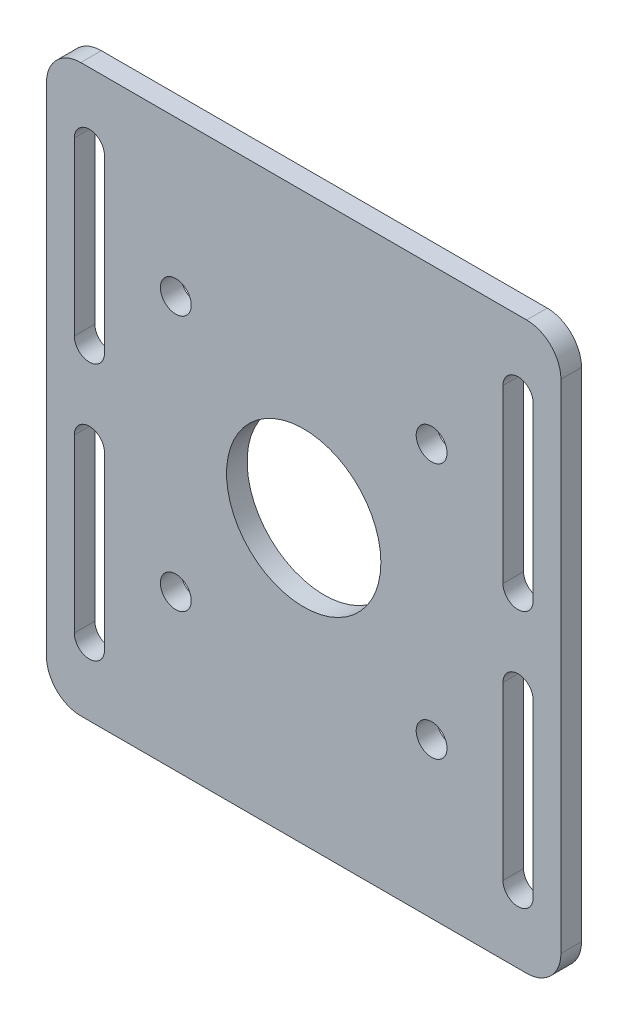
ISO-10303-21;
HEADER;
FILE_DESCRIPTION(('STEP AP214'),'2;1');
FILE_NAME('part.step','',(''),(''),'','','');
FILE_SCHEMA(('AUTOMOTIVE_DESIGN { 1 0 10303 214 1 1 1 1 }'));
ENDSEC;
DATA;
#1=APPLICATION_CONTEXT('core data for automotive mechanical design processes');
#2=APPLICATION_PROTOCOL_DEFINITION('international standard','automotive_design',2000,#1);
#3=PRODUCT_CONTEXT('',#1,'mechanical');
#4=PRODUCT('Part','Part','',(#3));
#5=PRODUCT_RELATED_PRODUCT_CATEGORY('part','',(#4));
#6=PRODUCT_DEFINITION_FORMATION('','',#4);
#7=PRODUCT_DEFINITION_CONTEXT('part definition',#1,'design');
#8=PRODUCT_DEFINITION('design','',#6,#7);
#9=PRODUCT_DEFINITION_SHAPE('','',#8);
#10=(LENGTH_UNIT() NAMED_UNIT(*) SI_UNIT(.MILLI.,.METRE.));
#11=(NAMED_UNIT(*) PLANE_ANGLE_UNIT() SI_UNIT($,.RADIAN.));
#12=(NAMED_UNIT(*) SI_UNIT($,.STERADIAN.) SOLID_ANGLE_UNIT());
#13=UNCERTAINTY_MEASURE_WITH_UNIT(LENGTH_MEASURE(1.E-05),#10,'distance_accuracy_value','');
#14=(GEOMETRIC_REPRESENTATION_CONTEXT(3) GLOBAL_UNCERTAINTY_ASSIGNED_CONTEXT((#13)) GLOBAL_UNIT_ASSIGNED_CONTEXT((#10,
#11,#12)) REPRESENTATION_CONTEXT('',''));
#15=CARTESIAN_POINT('',(0.,0.,0.));
#16=DIRECTION('',(0.,0.,1.));
#17=DIRECTION('',(1.,0.,0.));
#18=AXIS2_PLACEMENT_3D('',#15,#16,#17);
#19=CARTESIAN_POINT('',(0.,0.,6.));
#20=DIRECTION('',(0.,0.,-1.));
#21=DIRECTION('',(-1.,0.,0.));
#22=AXIS2_PLACEMENT_3D('',#19,#20,#21);
#23=PLANE('',#22);
#24=CARTESIAN_POINT('',(-74.5997654151811,-74.5997654151804,6.));
#25=DIRECTION('',(0.,0.,1.));
#26=DIRECTION('',(1.,0.,0.));
#27=AXIS2_PLACEMENT_3D('',#24,#25,#26);
#28=CIRCLE('',#27,8.99999999999999);
#29=CARTESIAN_POINT('',(-65.5997654151811,-74.5997654151804,6.));
#30=VERTEX_POINT('',#29);
#31=EDGE_CURVE('E788',#30,#30,#28,.T.);
#32=ORIENTED_EDGE('',*,*,#31,.F.);
#33=EDGE_LOOP('',(#32));
#34=FACE_BOUND('',#33,.T.);
#35=CARTESIAN_POINT('',(74.5997654151804,-74.5997654151811,6.));
#36=DIRECTION('',(0.,0.,1.));
#37=DIRECTION('',(1.,0.,0.));
#38=AXIS2_PLACEMENT_3D('',#35,#36,#37);
#39=CIRCLE('',#38,8.99999999999999);
#40=CARTESIAN_POINT('',(83.5997654151804,-74.5997654151811,6.));
#41=VERTEX_POINT('',#40);
#42=EDGE_CURVE('E793',#41,#41,#39,.T.);
#43=ORIENTED_EDGE('',*,*,#42,.F.);
#44=EDGE_LOOP('',(#43));
#45=FACE_BOUND('',#44,.T.);
#46=CARTESIAN_POINT('',(74.5997654151812,74.5997654151804,6.));
#47=DIRECTION('',(0.,0.,1.));
#48=DIRECTION('',(1.,0.,0.));
#49=AXIS2_PLACEMENT_3D('',#46,#47,#48);
#50=CIRCLE('',#49,8.99999999999999);
#51=CARTESIAN_POINT('',(83.5997654151811,74.5997654151804,6.));
#52=VERTEX_POINT('',#51);
#53=EDGE_CURVE('E813',#52,#52,#50,.T.);
#54=ORIENTED_EDGE('',*,*,#53,.F.);
#55=EDGE_LOOP('',(#54));
#56=FACE_BOUND('',#55,.T.);
#57=CARTESIAN_POINT('',(-74.5997654151804,74.5997654151812,6.));
#58=DIRECTION('',(0.,0.,1.));
#59=DIRECTION('',(1.,0.,0.));
#60=AXIS2_PLACEMENT_3D('',#57,#58,#59);
#61=CIRCLE('',#60,8.99999999999999);
#62=CARTESIAN_POINT('',(-65.5997654151804,74.5997654151812,6.));
#63=VERTEX_POINT('',#62);
#64=EDGE_CURVE('E803',#63,#63,#61,.T.);
#65=ORIENTED_EDGE('',*,*,#64,.F.);
#66=EDGE_LOOP('',(#65));
#67=FACE_BOUND('',#66,.T.);
#68=DIRECTION('',(0.,-1.,0.));
#69=VECTOR('',#68,1.);
#70=CARTESIAN_POINT('',(116.2,125.,6.));
#71=LINE('',#70,#69);
#72=CARTESIAN_POINT('',(116.2,125.,6.));
#73=VERTEX_POINT('',#72);
#74=CARTESIAN_POINT('',(116.2,25.,6.));
#75=VERTEX_POINT('',#74);
#76=EDGE_CURVE('E335',#73,#75,#71,.T.);
#77=ORIENTED_EDGE('',*,*,#76,.F.);
#78=CARTESIAN_POINT('',(125.,125.,6.));
#79=DIRECTION('',(0.,0.,1.));
#80=DIRECTION('',(-1.,0.,0.));
#81=AXIS2_PLACEMENT_3D('',#78,#79,#80);
#82=CIRCLE('',#81,8.79999999999998);
#83=CARTESIAN_POINT('',(133.8,125.,6.));
#84=VERTEX_POINT('',#83);
#85=EDGE_CURVE('E332',#84,#73,#82,.T.);
#86=ORIENTED_EDGE('',*,*,#85,.F.);
#87=DIRECTION('',(0.,1.,0.));
#88=VECTOR('',#87,1.);
#89=CARTESIAN_POINT('',(133.8,125.,6.));
#90=LINE('',#89,#88);
#91=CARTESIAN_POINT('',(133.8,25.,6.));
#92=VERTEX_POINT('',#91);
#93=EDGE_CURVE('E319',#92,#84,#90,.T.);
#94=ORIENTED_EDGE('',*,*,#93,.F.);
#95=CARTESIAN_POINT('',(125.,25.,6.));
#96=DIRECTION('',(0.,0.,1.));
#97=DIRECTION('',(-1.,0.,0.));
#98=AXIS2_PLACEMENT_3D('',#95,#96,#97);
#99=CIRCLE('',#98,8.79999999999997);
#100=EDGE_CURVE('E339',#75,#92,#99,.T.);
#101=ORIENTED_EDGE('',*,*,#100,.F.);
#102=EDGE_LOOP('',(#77,#86,#94,#101));
#103=FACE_BOUND('',#102,.T.);
#104=DIRECTION('',(0.,1.,0.));
#105=VECTOR('',#104,1.);
#106=CARTESIAN_POINT('',(133.8,-125.,6.));
#107=LINE('',#106,#105);
#108=CARTESIAN_POINT('',(133.8,-125.,6.));
#109=VERTEX_POINT('',#108);
#110=CARTESIAN_POINT('',(133.8,-25.,6.));
#111=VERTEX_POINT('',#110);
#112=EDGE_CURVE('E291',#109,#111,#107,.T.);
#113=ORIENTED_EDGE('',*,*,#112,.F.);
#114=CARTESIAN_POINT('',(125.,-125.,6.));
#115=DIRECTION('',(0.,0.,1.));
#116=DIRECTION('',(1.,0.,0.));
#117=AXIS2_PLACEMENT_3D('',#114,#115,#116);
#118=CIRCLE('',#117,8.79999999999998);
#119=CARTESIAN_POINT('',(116.2,-125.,6.));
#120=VERTEX_POINT('',#119);
#121=EDGE_CURVE('E288',#120,#109,#118,.T.);
#122=ORIENTED_EDGE('',*,*,#121,.F.);
#123=DIRECTION('',(0.,-1.,0.));
#124=VECTOR('',#123,1.);
#125=CARTESIAN_POINT('',(116.2,-125.,6.));
#126=LINE('',#125,#124);
#127=CARTESIAN_POINT('',(116.2,-25.,6.));
#128=VERTEX_POINT('',#127);
#129=EDGE_CURVE('E275',#128,#120,#126,.T.);
#130=ORIENTED_EDGE('',*,*,#129,.F.);
#131=CARTESIAN_POINT('',(125.,-25.,6.));
#132=DIRECTION('',(0.,0.,1.));
#133=DIRECTION('',(1.,0.,0.));
#134=AXIS2_PLACEMENT_3D('',#131,#132,#133);
#135=CIRCLE('',#134,8.79999999999997);
#136=EDGE_CURVE('E296',#111,#128,#135,.T.);
#137=ORIENTED_EDGE('',*,*,#136,.F.);
#138=EDGE_LOOP('',(#113,#122,#130,#137));
#139=FACE_BOUND('',#138,.T.);
#140=DIRECTION('',(0.,1.,0.));
#141=VECTOR('',#140,1.);
#142=CARTESIAN_POINT('',(-116.2,-125.,6.));
#143=LINE('',#142,#141);
#144=CARTESIAN_POINT('',(-116.2,-125.,6.));
#145=VERTEX_POINT('',#144);
#146=CARTESIAN_POINT('',(-116.2,-25.,6.));
#147=VERTEX_POINT('',#146);
#148=EDGE_CURVE('E254',#145,#147,#143,.T.);
#149=ORIENTED_EDGE('',*,*,#148,.F.);
#150=CARTESIAN_POINT('',(-125.,-125.,6.));
#151=DIRECTION('',(0.,0.,1.));
#152=DIRECTION('',(-1.,0.,0.));
#153=AXIS2_PLACEMENT_3D('',#150,#151,#152);
#154=CIRCLE('',#153,8.79999999999997);
#155=CARTESIAN_POINT('',(-133.8,-125.,6.));
#156=VERTEX_POINT('',#155);
#157=EDGE_CURVE('E216',#156,#145,#154,.T.);
#158=ORIENTED_EDGE('',*,*,#157,.F.);
#159=DIRECTION('',(0.,-1.,0.));
#160=VECTOR('',#159,1.);
#161=CARTESIAN_POINT('',(-133.8,-125.,6.));
#162=LINE('',#161,#160);
#163=CARTESIAN_POINT('',(-133.8,-24.9999999999999,6.));
#164=VERTEX_POINT('',#163);
#165=EDGE_CURVE('E237',#164,#156,#162,.T.);
#166=ORIENTED_EDGE('',*,*,#165,.F.);
#167=CARTESIAN_POINT('',(-125.,-25.,6.));
#168=DIRECTION('',(0.,0.,1.));
#169=DIRECTION('',(-1.,0.,0.));
#170=AXIS2_PLACEMENT_3D('',#167,#168,#169);
#171=CIRCLE('',#170,8.79999999999997);
#172=EDGE_CURVE('E242',#147,#164,#171,.T.);
#173=ORIENTED_EDGE('',*,*,#172,.F.);
#174=EDGE_LOOP('',(#149,#158,#166,#173));
#175=FACE_BOUND('',#174,.T.);
#176=DIRECTION('',(0.,-1.,0.));
#177=VECTOR('',#176,1.);
#178=CARTESIAN_POINT('',(-133.8,125.,6.));
#179=LINE('',#178,#177);
#180=CARTESIAN_POINT('',(-133.8,125.,6.));
#181=VERTEX_POINT('',#180);
#182=CARTESIAN_POINT('',(-133.8,24.9999999999999,6.));
#183=VERTEX_POINT('',#182);
#184=EDGE_CURVE('E377',#181,#183,#179,.T.);
#185=ORIENTED_EDGE('',*,*,#184,.F.);
#186=CARTESIAN_POINT('',(-125.,125.,6.));
#187=DIRECTION('',(0.,0.,1.));
#188=DIRECTION('',(1.,0.,0.));
#189=AXIS2_PLACEMENT_3D('',#186,#187,#188);
#190=CIRCLE('',#189,8.79999999999997);
#191=CARTESIAN_POINT('',(-116.2,125.,6.));
#192=VERTEX_POINT('',#191);
#193=EDGE_CURVE('E264',#192,#181,#190,.T.);
#194=ORIENTED_EDGE('',*,*,#193,.F.);
#195=DIRECTION('',(0.,1.,0.));
#196=VECTOR('',#195,1.);
#197=CARTESIAN_POINT('',(-116.2,125.,6.));
#198=LINE('',#197,#196);
#199=CARTESIAN_POINT('',(-116.2,25.,6.));
#200=VERTEX_POINT('',#199);
#201=EDGE_CURVE('E362',#200,#192,#198,.T.);
#202=ORIENTED_EDGE('',*,*,#201,.F.);
#203=CARTESIAN_POINT('',(-125.,25.,6.));
#204=DIRECTION('',(0.,0.,1.));
#205=DIRECTION('',(1.,0.,0.));
#206=AXIS2_PLACEMENT_3D('',#203,#204,#205);
#207=CIRCLE('',#206,8.79999999999997);
#208=EDGE_CURVE('E381',#183,#200,#207,.T.);
#209=ORIENTED_EDGE('',*,*,#208,.F.);
#210=EDGE_LOOP('',(#185,#194,#202,#209));
#211=FACE_BOUND('',#210,.T.);
#212=DIRECTION('',(1.,0.,0.));
#213=VECTOR('',#212,1.);
#214=CARTESIAN_POINT('',(-150.,-165.,6.));
#215=LINE('',#214,#213);
#216=CARTESIAN_POINT('',(-130.,-165.,6.));
#217=VERTEX_POINT('',#216);
#218=CARTESIAN_POINT('',(130.,-165.,6.));
#219=VERTEX_POINT('',#218);
#220=EDGE_CURVE('E420',#217,#219,#215,.T.);
#221=ORIENTED_EDGE('',*,*,#220,.T.);
#222=CARTESIAN_POINT('',(130.,-145.,6.));
#223=DIRECTION('',(0.,0.,-1.));
#224=DIRECTION('',(-1.,0.,0.));
#225=AXIS2_PLACEMENT_3D('',#222,#223,#224);
#226=CIRCLE('',#225,20.);
#227=CARTESIAN_POINT('',(150.,-145.,6.));
#228=VERTEX_POINT('',#227);
#229=EDGE_CURVE('E471',#219,#228,#226,.F.);
#230=ORIENTED_EDGE('',*,*,#229,.T.);
#231=DIRECTION('',(0.,1.,0.));
#232=VECTOR('',#231,1.);
#233=CARTESIAN_POINT('',(150.,-165.,6.));
#234=LINE('',#233,#232);
#235=CARTESIAN_POINT('',(150.,145.,6.));
#236=VERTEX_POINT('',#235);
#237=EDGE_CURVE('E409',#228,#236,#234,.T.);
#238=ORIENTED_EDGE('',*,*,#237,.T.);
#239=CARTESIAN_POINT('',(130.,145.,6.));
#240=DIRECTION('',(0.,0.,-1.));
#241=DIRECTION('',(-1.,0.,0.));
#242=AXIS2_PLACEMENT_3D('',#239,#240,#241);
#243=CIRCLE('',#242,20.);
#244=CARTESIAN_POINT('',(130.,165.,6.));
#245=VERTEX_POINT('',#244);
#246=EDGE_CURVE('E465',#236,#245,#243,.F.);
#247=ORIENTED_EDGE('',*,*,#246,.T.);
#248=DIRECTION('',(-1.,0.,0.));
#249=VECTOR('',#248,1.);
#250=CARTESIAN_POINT('',(-150.,165.,6.));
#251=LINE('',#250,#249);
#252=CARTESIAN_POINT('',(-130.,165.,6.));
#253=VERTEX_POINT('',#252);
#254=EDGE_CURVE('E413',#245,#253,#251,.T.);
#255=ORIENTED_EDGE('',*,*,#254,.T.);
#256=CARTESIAN_POINT('',(-130.,145.,6.));
#257=DIRECTION('',(0.,0.,-1.));
#258=DIRECTION('',(-1.,0.,0.));
#259=AXIS2_PLACEMENT_3D('',#256,#257,#258);
#260=CIRCLE('',#259,20.);
#261=CARTESIAN_POINT('',(-150.,145.,6.));
#262=VERTEX_POINT('',#261);
#263=EDGE_CURVE('E68',#253,#262,#260,.F.);
#264=ORIENTED_EDGE('',*,*,#263,.T.);
#265=DIRECTION('',(0.,-1.,0.));
#266=VECTOR('',#265,1.);
#267=CARTESIAN_POINT('',(-150.,-165.,6.));
#268=LINE('',#267,#266);
#269=CARTESIAN_POINT('',(-150.,-145.,6.));
#270=VERTEX_POINT('',#269);
#271=EDGE_CURVE('E417',#262,#270,#268,.T.);
#272=ORIENTED_EDGE('',*,*,#271,.T.);
#273=CARTESIAN_POINT('',(-130.,-145.,6.));
#274=DIRECTION('',(0.,0.,-1.));
#275=DIRECTION('',(-1.,0.,0.));
#276=AXIS2_PLACEMENT_3D('',#273,#274,#275);
#277=CIRCLE('',#276,20.);
#278=EDGE_CURVE('E468',#270,#217,#277,.F.);
#279=ORIENTED_EDGE('',*,*,#278,.T.);
#280=EDGE_LOOP('',(#221,#230,#238,#247,#255,#264,#272,#279));
#281=FACE_BOUND('',#280,.T.);
#282=CARTESIAN_POINT('',(0.,0.,6.));
#283=DIRECTION('',(0.,0.,1.));
#284=DIRECTION('',(1.,0.,0.));
#285=AXIS2_PLACEMENT_3D('',#282,#283,#284);
#286=CIRCLE('',#285,45.);
#287=CARTESIAN_POINT('',(45.,0.,6.));
#288=VERTEX_POINT('',#287);
#289=EDGE_CURVE('E401',#288,#288,#286,.T.);
#290=ORIENTED_EDGE('',*,*,#289,.F.);
#291=EDGE_LOOP('',(#290));
#292=FACE_BOUND('',#291,.T.);
#293=ADVANCED_FACE('F45',(#34,#45,#56,#67,#103,#139,#175,#211,#281,#292),#23,.F.);
#294=CARTESIAN_POINT('',(0.,0.,-6.));
#295=DIRECTION('',(0.,0.,-1.));
#296=DIRECTION('',(-1.,0.,0.));
#297=AXIS2_PLACEMENT_3D('',#294,#295,#296);
#298=PLANE('',#297);
#299=CARTESIAN_POINT('',(-74.5997654151811,-74.5997654151804,-6.));
#300=DIRECTION('',(0.,0.,-1.));
#301=DIRECTION('',(-1.,0.,0.));
#302=AXIS2_PLACEMENT_3D('',#299,#300,#301);
#303=CIRCLE('',#302,8.99999999999999);
#304=CARTESIAN_POINT('',(-83.5997654151811,-74.5997654151804,-6.));
#305=VERTEX_POINT('',#304);
#306=EDGE_CURVE('E791',#305,#305,#303,.F.);
#307=ORIENTED_EDGE('',*,*,#306,.T.);
#308=EDGE_LOOP('',(#307));
#309=FACE_BOUND('',#308,.T.);
#310=CARTESIAN_POINT('',(74.5997654151804,-74.5997654151811,-6.));
#311=DIRECTION('',(0.,0.,-1.));
#312=DIRECTION('',(-1.,0.,0.));
#313=AXIS2_PLACEMENT_3D('',#310,#311,#312);
#314=CIRCLE('',#313,8.99999999999999);
#315=CARTESIAN_POINT('',(65.5997654151804,-74.5997654151811,-6.));
#316=VERTEX_POINT('',#315);
#317=EDGE_CURVE('E799',#316,#316,#314,.F.);
#318=ORIENTED_EDGE('',*,*,#317,.T.);
#319=EDGE_LOOP('',(#318));
#320=FACE_BOUND('',#319,.T.);
#321=CARTESIAN_POINT('',(74.5997654151812,74.5997654151804,-6.));
#322=DIRECTION('',(0.,0.,-1.));
#323=DIRECTION('',(-1.,0.,0.));
#324=AXIS2_PLACEMENT_3D('',#321,#322,#323);
#325=CIRCLE('',#324,8.99999999999999);
#326=CARTESIAN_POINT('',(65.5997654151812,74.5997654151804,-6.));
#327=VERTEX_POINT('',#326);
#328=EDGE_CURVE('E806',#327,#327,#325,.F.);
#329=ORIENTED_EDGE('',*,*,#328,.T.);
#330=EDGE_LOOP('',(#329));
#331=FACE_BOUND('',#330,.T.);
#332=CARTESIAN_POINT('',(-74.5997654151804,74.5997654151812,-6.));
#333=DIRECTION('',(0.,0.,-1.));
#334=DIRECTION('',(-1.,0.,0.));
#335=AXIS2_PLACEMENT_3D('',#332,#333,#334);
#336=CIRCLE('',#335,8.99999999999999);
#337=CARTESIAN_POINT('',(-83.5997654151804,74.5997654151812,-6.));
#338=VERTEX_POINT('',#337);
#339=EDGE_CURVE('E245',#338,#338,#336,.F.);
#340=ORIENTED_EDGE('',*,*,#339,.T.);
#341=EDGE_LOOP('',(#340));
#342=FACE_BOUND('',#341,.T.);
#343=CARTESIAN_POINT('',(125.,125.,-6.));
#344=DIRECTION('',(0.,0.,1.));
#345=DIRECTION('',(-1.,0.,0.));
#346=AXIS2_PLACEMENT_3D('',#343,#344,#345);
#347=CIRCLE('',#346,8.79999999999998);
#348=CARTESIAN_POINT('',(133.8,125.,-6.));
#349=VERTEX_POINT('',#348);
#350=CARTESIAN_POINT('',(116.2,125.,-6.));
#351=VERTEX_POINT('',#350);
#352=EDGE_CURVE('E314',#349,#351,#347,.T.);
#353=ORIENTED_EDGE('',*,*,#352,.T.);
#354=DIRECTION('',(0.,-1.,0.));
#355=VECTOR('',#354,1.);
#356=CARTESIAN_POINT('',(116.2,125.,-6.));
#357=LINE('',#356,#355);
#358=CARTESIAN_POINT('',(116.2,25.,-6.));
#359=VERTEX_POINT('',#358);
#360=EDGE_CURVE('E318',#351,#359,#357,.T.);
#361=ORIENTED_EDGE('',*,*,#360,.T.);
#362=CARTESIAN_POINT('',(125.,25.,-6.));
#363=DIRECTION('',(0.,0.,1.));
#364=DIRECTION('',(-1.,0.,0.));
#365=AXIS2_PLACEMENT_3D('',#362,#363,#364);
#366=CIRCLE('',#365,8.79999999999997);
#367=CARTESIAN_POINT('',(133.8,25.,-6.));
#368=VERTEX_POINT('',#367);
#369=EDGE_CURVE('E323',#359,#368,#366,.T.);
#370=ORIENTED_EDGE('',*,*,#369,.T.);
#371=DIRECTION('',(0.,1.,0.));
#372=VECTOR('',#371,1.);
#373=CARTESIAN_POINT('',(133.8,125.,-6.));
#374=LINE('',#373,#372);
#375=EDGE_CURVE('E327',#368,#349,#374,.T.);
#376=ORIENTED_EDGE('',*,*,#375,.T.);
#377=EDGE_LOOP('',(#353,#361,#370,#376));
#378=FACE_BOUND('',#377,.T.);
#379=CARTESIAN_POINT('',(125.,-125.,-6.));
#380=DIRECTION('',(0.,0.,1.));
#381=DIRECTION('',(1.,0.,0.));
#382=AXIS2_PLACEMENT_3D('',#379,#380,#381);
#383=CIRCLE('',#382,8.79999999999998);
#384=CARTESIAN_POINT('',(116.2,-125.,-6.));
#385=VERTEX_POINT('',#384);
#386=CARTESIAN_POINT('',(133.8,-125.,-6.));
#387=VERTEX_POINT('',#386);
#388=EDGE_CURVE('E270',#385,#387,#383,.T.);
#389=ORIENTED_EDGE('',*,*,#388,.T.);
#390=DIRECTION('',(0.,1.,0.));
#391=VECTOR('',#390,1.);
#392=CARTESIAN_POINT('',(133.8,-125.,-6.));
#393=LINE('',#392,#391);
#394=CARTESIAN_POINT('',(133.8,-25.,-6.));
#395=VERTEX_POINT('',#394);
#396=EDGE_CURVE('E274',#387,#395,#393,.T.);
#397=ORIENTED_EDGE('',*,*,#396,.T.);
#398=CARTESIAN_POINT('',(125.,-25.,-6.));
#399=DIRECTION('',(0.,0.,1.));
#400=DIRECTION('',(1.,0.,0.));
#401=AXIS2_PLACEMENT_3D('',#398,#399,#400);
#402=CIRCLE('',#401,8.79999999999997);
#403=CARTESIAN_POINT('',(116.2,-25.,-6.));
#404=VERTEX_POINT('',#403);
#405=EDGE_CURVE('E279',#395,#404,#402,.T.);
#406=ORIENTED_EDGE('',*,*,#405,.T.);
#407=DIRECTION('',(0.,-1.,0.));
#408=VECTOR('',#407,1.);
#409=CARTESIAN_POINT('',(116.2,-125.,-6.));
#410=LINE('',#409,#408);
#411=EDGE_CURVE('E283',#404,#385,#410,.T.);
#412=ORIENTED_EDGE('',*,*,#411,.T.);
#413=EDGE_LOOP('',(#389,#397,#406,#412));
#414=FACE_BOUND('',#413,.T.);
#415=CARTESIAN_POINT('',(-125.,-125.,-6.));
#416=DIRECTION('',(0.,0.,1.));
#417=DIRECTION('',(-1.,0.,0.));
#418=AXIS2_PLACEMENT_3D('',#415,#416,#417);
#419=CIRCLE('',#418,8.79999999999997);
#420=CARTESIAN_POINT('',(-133.8,-125.,-6.));
#421=VERTEX_POINT('',#420);
#422=CARTESIAN_POINT('',(-116.2,-125.,-6.));
#423=VERTEX_POINT('',#422);
#424=EDGE_CURVE('E213',#421,#423,#419,.T.);
#425=ORIENTED_EDGE('',*,*,#424,.T.);
#426=DIRECTION('',(0.,1.,0.));
#427=VECTOR('',#426,1.);
#428=CARTESIAN_POINT('',(-116.2,-125.,-6.));
#429=LINE('',#428,#427);
#430=CARTESIAN_POINT('',(-116.2,-25.,-6.));
#431=VERTEX_POINT('',#430);
#432=EDGE_CURVE('E226',#423,#431,#429,.T.);
#433=ORIENTED_EDGE('',*,*,#432,.T.);
#434=CARTESIAN_POINT('',(-125.,-25.,-6.));
#435=DIRECTION('',(0.,0.,1.));
#436=DIRECTION('',(-1.,0.,0.));
#437=AXIS2_PLACEMENT_3D('',#434,#435,#436);
#438=CIRCLE('',#437,8.79999999999997);
#439=CARTESIAN_POINT('',(-133.8,-24.9999999999999,-6.));
#440=VERTEX_POINT('',#439);
#441=EDGE_CURVE('E231',#431,#440,#438,.T.);
#442=ORIENTED_EDGE('',*,*,#441,.T.);
#443=DIRECTION('',(0.,-1.,0.));
#444=VECTOR('',#443,1.);
#445=CARTESIAN_POINT('',(-133.8,-125.,-6.));
#446=LINE('',#445,#444);
#447=EDGE_CURVE('E222',#440,#421,#446,.T.);
#448=ORIENTED_EDGE('',*,*,#447,.T.);
#449=EDGE_LOOP('',(#425,#433,#442,#448));
#450=FACE_BOUND('',#449,.T.);
#451=CARTESIAN_POINT('',(-125.,125.,-6.));
#452=DIRECTION('',(0.,0.,1.));
#453=DIRECTION('',(1.,0.,0.));
#454=AXIS2_PLACEMENT_3D('',#451,#452,#453);
#455=CIRCLE('',#454,8.79999999999997);
#456=CARTESIAN_POINT('',(-116.2,125.,-6.));
#457=VERTEX_POINT('',#456);
#458=CARTESIAN_POINT('',(-133.8,125.,-6.));
#459=VERTEX_POINT('',#458);
#460=EDGE_CURVE('E357',#457,#459,#455,.T.);
#461=ORIENTED_EDGE('',*,*,#460,.T.);
#462=DIRECTION('',(0.,-1.,0.));
#463=VECTOR('',#462,1.);
#464=CARTESIAN_POINT('',(-133.8,125.,-6.));
#465=LINE('',#464,#463);
#466=CARTESIAN_POINT('',(-133.8,24.9999999999999,-6.));
#467=VERTEX_POINT('',#466);
#468=EDGE_CURVE('E361',#459,#467,#465,.T.);
#469=ORIENTED_EDGE('',*,*,#468,.T.);
#470=CARTESIAN_POINT('',(-125.,25.,-6.));
#471=DIRECTION('',(0.,0.,1.));
#472=DIRECTION('',(1.,0.,0.));
#473=AXIS2_PLACEMENT_3D('',#470,#471,#472);
#474=CIRCLE('',#473,8.79999999999997);
#475=CARTESIAN_POINT('',(-116.2,25.,-6.));
#476=VERTEX_POINT('',#475);
#477=EDGE_CURVE('E366',#467,#476,#474,.T.);
#478=ORIENTED_EDGE('',*,*,#477,.T.);
#479=DIRECTION('',(0.,1.,0.));
#480=VECTOR('',#479,1.);
#481=CARTESIAN_POINT('',(-116.2,125.,-6.));
#482=LINE('',#481,#480);
#483=EDGE_CURVE('E370',#476,#457,#482,.T.);
#484=ORIENTED_EDGE('',*,*,#483,.T.);
#485=EDGE_LOOP('',(#461,#469,#478,#484));
#486=FACE_BOUND('',#485,.T.);
#487=DIRECTION('',(0.,1.,0.));
#488=VECTOR('',#487,1.);
#489=CARTESIAN_POINT('',(150.,-165.,-6.));
#490=LINE('',#489,#488);
#491=CARTESIAN_POINT('',(150.,-145.,-6.));
#492=VERTEX_POINT('',#491);
#493=CARTESIAN_POINT('',(150.,145.,-6.));
#494=VERTEX_POINT('',#493);
#495=EDGE_CURVE('E405',#492,#494,#490,.T.);
#496=ORIENTED_EDGE('',*,*,#495,.F.);
#497=CARTESIAN_POINT('',(130.,-145.,-6.));
#498=DIRECTION('',(0.,0.,-1.));
#499=DIRECTION('',(-1.,0.,0.));
#500=AXIS2_PLACEMENT_3D('',#497,#498,#499);
#501=CIRCLE('',#500,20.);
#502=CARTESIAN_POINT('',(130.,-165.,-6.));
#503=VERTEX_POINT('',#502);
#504=EDGE_CURVE('E453',#492,#503,#501,.T.);
#505=ORIENTED_EDGE('',*,*,#504,.T.);
#506=DIRECTION('',(1.,0.,0.));
#507=VECTOR('',#506,1.);
#508=CARTESIAN_POINT('',(-150.,-165.,-6.));
#509=LINE('',#508,#507);
#510=CARTESIAN_POINT('',(-130.,-165.,-6.));
#511=VERTEX_POINT('',#510);
#512=EDGE_CURVE('E414',#511,#503,#509,.T.);
#513=ORIENTED_EDGE('',*,*,#512,.F.);
#514=CARTESIAN_POINT('',(-130.,-145.,-6.));
#515=DIRECTION('',(0.,0.,-1.));
#516=DIRECTION('',(-1.,0.,0.));
#517=AXIS2_PLACEMENT_3D('',#514,#515,#516);
#518=CIRCLE('',#517,20.);
#519=CARTESIAN_POINT('',(-150.,-145.,-6.));
#520=VERTEX_POINT('',#519);
#521=EDGE_CURVE('E450',#511,#520,#518,.T.);
#522=ORIENTED_EDGE('',*,*,#521,.T.);
#523=DIRECTION('',(0.,-1.,0.));
#524=VECTOR('',#523,1.);
#525=CARTESIAN_POINT('',(-150.,-165.,-6.));
#526=LINE('',#525,#524);
#527=CARTESIAN_POINT('',(-150.,145.,-6.));
#528=VERTEX_POINT('',#527);
#529=EDGE_CURVE('E432',#528,#520,#526,.T.);
#530=ORIENTED_EDGE('',*,*,#529,.F.);
#531=CARTESIAN_POINT('',(-130.,145.,-6.));
#532=DIRECTION('',(0.,0.,-1.));
#533=DIRECTION('',(-1.,0.,0.));
#534=AXIS2_PLACEMENT_3D('',#531,#532,#533);
#535=CIRCLE('',#534,20.);
#536=CARTESIAN_POINT('',(-130.,165.,-6.));
#537=VERTEX_POINT('',#536);
#538=EDGE_CURVE('E444',#528,#537,#535,.T.);
#539=ORIENTED_EDGE('',*,*,#538,.T.);
#540=DIRECTION('',(-1.,0.,0.));
#541=VECTOR('',#540,1.);
#542=CARTESIAN_POINT('',(-150.,165.,-6.));
#543=LINE('',#542,#541);
#544=CARTESIAN_POINT('',(130.,165.,-6.));
#545=VERTEX_POINT('',#544);
#546=EDGE_CURVE('E428',#545,#537,#543,.T.);
#547=ORIENTED_EDGE('',*,*,#546,.F.);
#548=CARTESIAN_POINT('',(130.,145.,-6.));
#549=DIRECTION('',(0.,0.,-1.));
#550=DIRECTION('',(-1.,0.,0.));
#551=AXIS2_PLACEMENT_3D('',#548,#549,#550);
#552=CIRCLE('',#551,20.);
#553=EDGE_CURVE('E447',#545,#494,#552,.T.);
#554=ORIENTED_EDGE('',*,*,#553,.T.);
#555=EDGE_LOOP('',(#496,#505,#513,#522,#530,#539,#547,#554));
#556=FACE_BOUND('',#555,.T.);
#557=CARTESIAN_POINT('',(0.,0.,-6.));
#558=DIRECTION('',(0.,0.,1.));
#559=DIRECTION('',(1.,0.,0.));
#560=AXIS2_PLACEMENT_3D('',#557,#558,#559);
#561=CIRCLE('',#560,45.);
#562=CARTESIAN_POINT('',(45.,0.,-6.));
#563=VERTEX_POINT('',#562);
#564=EDGE_CURVE('E391',#563,#563,#561,.T.);
#565=ORIENTED_EDGE('',*,*,#564,.T.);
#566=EDGE_LOOP('',(#565));
#567=FACE_BOUND('',#566,.T.);
#568=ADVANCED_FACE('F233',(#309,#320,#331,#342,#378,#414,#450,#486,#556,#567),#298,.T.);
#569=CARTESIAN_POINT('',(150.,-165.,6.));
#570=DIRECTION('',(-1.,0.,0.));
#571=DIRECTION('',(0.,0.,1.));
#572=AXIS2_PLACEMENT_3D('',#569,#570,#571);
#573=PLANE('',#572);
#574=ORIENTED_EDGE('',*,*,#237,.F.);
#575=DIRECTION('',(0.,0.,-1.));
#576=VECTOR('',#575,1.);
#577=CARTESIAN_POINT('',(150.,-145.,6.));
#578=LINE('',#577,#576);
#579=EDGE_CURVE('E440',#228,#492,#578,.T.);
#580=ORIENTED_EDGE('',*,*,#579,.T.);
#581=ORIENTED_EDGE('',*,*,#495,.T.);
#582=DIRECTION('',(0.,0.,-1.));
#583=VECTOR('',#582,1.);
#584=CARTESIAN_POINT('',(150.,145.,6.));
#585=LINE('',#584,#583);
#586=EDGE_CURVE('E424',#494,#236,#585,.F.);
#587=ORIENTED_EDGE('',*,*,#586,.T.);
#588=EDGE_LOOP('',(#574,#580,#581,#587));
#589=FACE_BOUND('',#588,.T.);
#590=ADVANCED_FACE('F511',(#589),#573,.F.);
#591=CARTESIAN_POINT('',(-150.,165.,6.));
#592=DIRECTION('',(0.,-1.,0.));
#593=DIRECTION('',(0.,0.,-1.));
#594=AXIS2_PLACEMENT_3D('',#591,#592,#593);
#595=PLANE('',#594);
#596=ORIENTED_EDGE('',*,*,#254,.F.);
#597=DIRECTION('',(0.,0.,-1.));
#598=VECTOR('',#597,1.);
#599=CARTESIAN_POINT('',(130.,165.,6.));
#600=LINE('',#599,#598);
#601=EDGE_CURVE('E11',#245,#545,#600,.T.);
#602=ORIENTED_EDGE('',*,*,#601,.T.);
#603=ORIENTED_EDGE('',*,*,#546,.T.);
#604=DIRECTION('',(0.,0.,-1.));
#605=VECTOR('',#604,1.);
#606=CARTESIAN_POINT('',(-130.,165.,6.));
#607=LINE('',#606,#605);
#608=EDGE_CURVE('E54',#537,#253,#607,.F.);
#609=ORIENTED_EDGE('',*,*,#608,.T.);
#610=EDGE_LOOP('',(#596,#602,#603,#609));
#611=FACE_BOUND('',#610,.T.);
#612=ADVANCED_FACE('F484',(#611),#595,.F.);
#613=CARTESIAN_POINT('',(-150.,-165.,6.));
#614=DIRECTION('',(1.,0.,0.));
#615=DIRECTION('',(0.,0.,-1.));
#616=AXIS2_PLACEMENT_3D('',#613,#614,#615);
#617=PLANE('',#616);
#618=ORIENTED_EDGE('',*,*,#529,.T.);
#619=DIRECTION('',(0.,0.,-1.));
#620=VECTOR('',#619,1.);
#621=CARTESIAN_POINT('',(-150.,-145.,6.));
#622=LINE('',#621,#620);
#623=EDGE_CURVE('E61',#520,#270,#622,.F.);
#624=ORIENTED_EDGE('',*,*,#623,.T.);
#625=ORIENTED_EDGE('',*,*,#271,.F.);
#626=DIRECTION('',(0.,0.,-1.));
#627=VECTOR('',#626,1.);
#628=CARTESIAN_POINT('',(-150.,145.,6.));
#629=LINE('',#628,#627);
#630=EDGE_CURVE('E474',#262,#528,#629,.T.);
#631=ORIENTED_EDGE('',*,*,#630,.T.);
#632=EDGE_LOOP('',(#618,#624,#625,#631));
#633=FACE_BOUND('',#632,.T.);
#634=ADVANCED_FACE('F492',(#633),#617,.F.);
#635=CARTESIAN_POINT('',(-150.,-165.,6.));
#636=DIRECTION('',(0.,1.,0.));
#637=DIRECTION('',(0.,0.,1.));
#638=AXIS2_PLACEMENT_3D('',#635,#636,#637);
#639=PLANE('',#638);
#640=ORIENTED_EDGE('',*,*,#512,.T.);
#641=DIRECTION('',(0.,0.,-1.));
#642=VECTOR('',#641,1.);
#643=CARTESIAN_POINT('',(130.,-165.,6.));
#644=LINE('',#643,#642);
#645=EDGE_CURVE('E460',#503,#219,#644,.F.);
#646=ORIENTED_EDGE('',*,*,#645,.T.);
#647=ORIENTED_EDGE('',*,*,#220,.F.);
#648=DIRECTION('',(0.,0.,-1.));
#649=VECTOR('',#648,1.);
#650=CARTESIAN_POINT('',(-130.,-165.,6.));
#651=LINE('',#650,#649);
#652=EDGE_CURVE('E456',#217,#511,#651,.T.);
#653=ORIENTED_EDGE('',*,*,#652,.T.);
#654=EDGE_LOOP('',(#640,#646,#647,#653));
#655=FACE_BOUND('',#654,.T.);
#656=ADVANCED_FACE('F503',(#655),#639,.F.);
#657=CARTESIAN_POINT('',(0.,0.,6.));
#658=DIRECTION('',(0.,0.,-1.));
#659=DIRECTION('',(-1.,0.,0.));
#660=AXIS2_PLACEMENT_3D('',#657,#658,#659);
#661=CYLINDRICAL_SURFACE('',#660,45.);
#662=ORIENTED_EDGE('',*,*,#289,.T.);
#663=EDGE_LOOP('',(#662));
#664=FACE_BOUND('',#663,.T.);
#665=ORIENTED_EDGE('',*,*,#564,.F.);
#666=EDGE_LOOP('',(#665));
#667=FACE_BOUND('',#666,.T.);
#668=ADVANCED_FACE('F533',(#664,#667),#661,.F.);
#669=CARTESIAN_POINT('',(-125.,125.,-6.));
#670=DIRECTION('',(0.,0.,1.));
#671=DIRECTION('',(1.,0.,0.));
#672=AXIS2_PLACEMENT_3D('',#669,#670,#671);
#673=CYLINDRICAL_SURFACE('',#672,8.79999999999997);
#674=ORIENTED_EDGE('',*,*,#193,.T.);
#675=DIRECTION('',(0.,0.,1.));
#676=VECTOR('',#675,1.);
#677=CARTESIAN_POINT('',(-133.8,125.,-6.));
#678=LINE('',#677,#676);
#679=EDGE_CURVE('E374',#459,#181,#678,.T.);
#680=ORIENTED_EDGE('',*,*,#679,.F.);
#681=ORIENTED_EDGE('',*,*,#460,.F.);
#682=DIRECTION('',(0.,0.,1.));
#683=VECTOR('',#682,1.);
#684=CARTESIAN_POINT('',(-116.2,125.,-6.));
#685=LINE('',#684,#683);
#686=EDGE_CURVE('E388',#457,#192,#685,.T.);
#687=ORIENTED_EDGE('',*,*,#686,.T.);
#688=EDGE_LOOP('',(#674,#680,#681,#687));
#689=FACE_BOUND('',#688,.T.);
#690=ADVANCED_FACE('F569',(#689),#673,.F.);
#691=CARTESIAN_POINT('',(-116.2,125.,-6.));
#692=DIRECTION('',(1.,0.,0.));
#693=DIRECTION('',(0.,1.,0.));
#694=AXIS2_PLACEMENT_3D('',#691,#692,#693);
#695=PLANE('',#694);
#696=ORIENTED_EDGE('',*,*,#201,.T.);
#697=ORIENTED_EDGE('',*,*,#686,.F.);
#698=ORIENTED_EDGE('',*,*,#483,.F.);
#699=DIRECTION('',(0.,0.,1.));
#700=VECTOR('',#699,1.);
#701=CARTESIAN_POINT('',(-116.2,25.,-6.));
#702=LINE('',#701,#700);
#703=EDGE_CURVE('E392',#476,#200,#702,.T.);
#704=ORIENTED_EDGE('',*,*,#703,.T.);
#705=EDGE_LOOP('',(#696,#697,#698,#704));
#706=FACE_BOUND('',#705,.T.);
#707=ADVANCED_FACE('F565',(#706),#695,.F.);
#708=CARTESIAN_POINT('',(-125.,25.,-6.));
#709=DIRECTION('',(0.,0.,1.));
#710=DIRECTION('',(1.,0.,0.));
#711=AXIS2_PLACEMENT_3D('',#708,#709,#710);
#712=CYLINDRICAL_SURFACE('',#711,8.79999999999997);
#713=ORIENTED_EDGE('',*,*,#208,.T.);
#714=ORIENTED_EDGE('',*,*,#703,.F.);
#715=ORIENTED_EDGE('',*,*,#477,.F.);
#716=DIRECTION('',(0.,0.,1.));
#717=VECTOR('',#716,1.);
#718=CARTESIAN_POINT('',(-133.8,24.9999999999999,-6.));
#719=LINE('',#718,#717);
#720=EDGE_CURVE('E395',#467,#183,#719,.T.);
#721=ORIENTED_EDGE('',*,*,#720,.T.);
#722=EDGE_LOOP('',(#713,#714,#715,#721));
#723=FACE_BOUND('',#722,.T.);
#724=ADVANCED_FACE('F568',(#723),#712,.F.);
#725=CARTESIAN_POINT('',(-133.8,125.,-6.));
#726=DIRECTION('',(-1.,0.,0.));
#727=DIRECTION('',(0.,0.,1.));
#728=AXIS2_PLACEMENT_3D('',#725,#726,#727);
#729=PLANE('',#728);
#730=ORIENTED_EDGE('',*,*,#184,.T.);
#731=ORIENTED_EDGE('',*,*,#720,.F.);
#732=ORIENTED_EDGE('',*,*,#468,.F.);
#733=ORIENTED_EDGE('',*,*,#679,.T.);
#734=EDGE_LOOP('',(#730,#731,#732,#733));
#735=FACE_BOUND('',#734,.T.);
#736=ADVANCED_FACE('F573',(#735),#729,.F.);
#737=CARTESIAN_POINT('',(-125.,-125.,-6.));
#738=DIRECTION('',(0.,0.,1.));
#739=DIRECTION('',(1.,0.,0.));
#740=AXIS2_PLACEMENT_3D('',#737,#738,#739);
#741=CYLINDRICAL_SURFACE('',#740,8.79999999999997);
#742=ORIENTED_EDGE('',*,*,#157,.T.);
#743=DIRECTION('',(0.,0.,1.));
#744=VECTOR('',#743,1.);
#745=CARTESIAN_POINT('',(-116.2,-125.,-6.));
#746=LINE('',#745,#744);
#747=EDGE_CURVE('E209',#423,#145,#746,.T.);
#748=ORIENTED_EDGE('',*,*,#747,.F.);
#749=ORIENTED_EDGE('',*,*,#424,.F.);
#750=DIRECTION('',(0.,0.,1.));
#751=VECTOR('',#750,1.);
#752=CARTESIAN_POINT('',(-133.8,-125.,-6.));
#753=LINE('',#752,#751);
#754=EDGE_CURVE('E261',#421,#156,#753,.T.);
#755=ORIENTED_EDGE('',*,*,#754,.T.);
#756=EDGE_LOOP('',(#742,#748,#749,#755));
#757=FACE_BOUND('',#756,.T.);
#758=ADVANCED_FACE('F211',(#757),#741,.F.);
#759=CARTESIAN_POINT('',(-133.8,-125.,-6.));
#760=DIRECTION('',(-1.,0.,0.));
#761=DIRECTION('',(0.,0.,1.));
#762=AXIS2_PLACEMENT_3D('',#759,#760,#761);
#763=PLANE('',#762);
#764=ORIENTED_EDGE('',*,*,#165,.T.);
#765=ORIENTED_EDGE('',*,*,#754,.F.);
#766=ORIENTED_EDGE('',*,*,#447,.F.);
#767=DIRECTION('',(0.,0.,1.));
#768=VECTOR('',#767,1.);
#769=CARTESIAN_POINT('',(-133.8,-24.9999999999999,-6.));
#770=LINE('',#769,#768);
#771=EDGE_CURVE('E265',#440,#164,#770,.T.);
#772=ORIENTED_EDGE('',*,*,#771,.T.);
#773=EDGE_LOOP('',(#764,#765,#766,#772));
#774=FACE_BOUND('',#773,.T.);
#775=ADVANCED_FACE('F634',(#774),#763,.F.);
#776=CARTESIAN_POINT('',(-125.,-25.,-6.));
#777=DIRECTION('',(0.,0.,1.));
#778=DIRECTION('',(1.,0.,0.));
#779=AXIS2_PLACEMENT_3D('',#776,#777,#778);
#780=CYLINDRICAL_SURFACE('',#779,8.79999999999997);
#781=ORIENTED_EDGE('',*,*,#172,.T.);
#782=ORIENTED_EDGE('',*,*,#771,.F.);
#783=ORIENTED_EDGE('',*,*,#441,.F.);
#784=DIRECTION('',(0.,0.,1.));
#785=VECTOR('',#784,1.);
#786=CARTESIAN_POINT('',(-116.2,-25.,-6.));
#787=LINE('',#786,#785);
#788=EDGE_CURVE('E221',#431,#147,#787,.T.);
#789=ORIENTED_EDGE('',*,*,#788,.T.);
#790=EDGE_LOOP('',(#781,#782,#783,#789));
#791=FACE_BOUND('',#790,.T.);
#792=ADVANCED_FACE('F643',(#791),#780,.F.);
#793=CARTESIAN_POINT('',(-116.2,-125.,-6.));
#794=DIRECTION('',(1.,0.,0.));
#795=DIRECTION('',(0.,1.,0.));
#796=AXIS2_PLACEMENT_3D('',#793,#794,#795);
#797=PLANE('',#796);
#798=ORIENTED_EDGE('',*,*,#148,.T.);
#799=ORIENTED_EDGE('',*,*,#788,.F.);
#800=ORIENTED_EDGE('',*,*,#432,.F.);
#801=ORIENTED_EDGE('',*,*,#747,.T.);
#802=EDGE_LOOP('',(#798,#799,#800,#801));
#803=FACE_BOUND('',#802,.T.);
#804=ADVANCED_FACE('F227',(#803),#797,.F.);
#805=CARTESIAN_POINT('',(125.,-125.,-6.));
#806=DIRECTION('',(0.,0.,1.));
#807=DIRECTION('',(1.,0.,0.));
#808=AXIS2_PLACEMENT_3D('',#805,#806,#807);
#809=CYLINDRICAL_SURFACE('',#808,8.79999999999998);
#810=ORIENTED_EDGE('',*,*,#121,.T.);
#811=DIRECTION('',(0.,0.,1.));
#812=VECTOR('',#811,1.);
#813=CARTESIAN_POINT('',(133.8,-125.,-6.));
#814=LINE('',#813,#812);
#815=EDGE_CURVE('E287',#387,#109,#814,.T.);
#816=ORIENTED_EDGE('',*,*,#815,.F.);
#817=ORIENTED_EDGE('',*,*,#388,.F.);
#818=DIRECTION('',(0.,0.,1.));
#819=VECTOR('',#818,1.);
#820=CARTESIAN_POINT('',(116.2,-125.,-6.));
#821=LINE('',#820,#819);
#822=EDGE_CURVE('E255',#385,#120,#821,.T.);
#823=ORIENTED_EDGE('',*,*,#822,.T.);
#824=EDGE_LOOP('',(#810,#816,#817,#823));
#825=FACE_BOUND('',#824,.T.);
#826=ADVANCED_FACE('F662',(#825),#809,.F.);
#827=CARTESIAN_POINT('',(116.2,-125.,-6.));
#828=DIRECTION('',(-1.,0.,0.));
#829=DIRECTION('',(0.,-1.,0.));
#830=AXIS2_PLACEMENT_3D('',#827,#828,#829);
#831=PLANE('',#830);
#832=ORIENTED_EDGE('',*,*,#129,.T.);
#833=ORIENTED_EDGE('',*,*,#822,.F.);
#834=ORIENTED_EDGE('',*,*,#411,.F.);
#835=DIRECTION('',(0.,0.,1.));
#836=VECTOR('',#835,1.);
#837=CARTESIAN_POINT('',(116.2,-25.,-6.));
#838=LINE('',#837,#836);
#839=EDGE_CURVE('E305',#404,#128,#838,.T.);
#840=ORIENTED_EDGE('',*,*,#839,.T.);
#841=EDGE_LOOP('',(#832,#833,#834,#840));
#842=FACE_BOUND('',#841,.T.);
#843=ADVANCED_FACE('F671',(#842),#831,.F.);
#844=CARTESIAN_POINT('',(125.,-25.,-6.));
#845=DIRECTION('',(0.,0.,1.));
#846=DIRECTION('',(1.,0.,0.));
#847=AXIS2_PLACEMENT_3D('',#844,#845,#846);
#848=CYLINDRICAL_SURFACE('',#847,8.79999999999997);
#849=ORIENTED_EDGE('',*,*,#136,.T.);
#850=ORIENTED_EDGE('',*,*,#839,.F.);
#851=ORIENTED_EDGE('',*,*,#405,.F.);
#852=DIRECTION('',(0.,0.,1.));
#853=VECTOR('',#852,1.);
#854=CARTESIAN_POINT('',(133.8,-25.,-6.));
#855=LINE('',#854,#853);
#856=EDGE_CURVE('E308',#395,#111,#855,.T.);
#857=ORIENTED_EDGE('',*,*,#856,.T.);
#858=EDGE_LOOP('',(#849,#850,#851,#857));
#859=FACE_BOUND('',#858,.T.);
#860=ADVANCED_FACE('F681',(#859),#848,.F.);
#861=CARTESIAN_POINT('',(133.8,-125.,-6.));
#862=DIRECTION('',(1.,0.,0.));
#863=DIRECTION('',(0.,0.,-1.));
#864=AXIS2_PLACEMENT_3D('',#861,#862,#863);
#865=PLANE('',#864);
#866=ORIENTED_EDGE('',*,*,#112,.T.);
#867=ORIENTED_EDGE('',*,*,#856,.F.);
#868=ORIENTED_EDGE('',*,*,#396,.F.);
#869=ORIENTED_EDGE('',*,*,#815,.T.);
#870=EDGE_LOOP('',(#866,#867,#868,#869));
#871=FACE_BOUND('',#870,.T.);
#872=ADVANCED_FACE('F563',(#871),#865,.F.);
#873=CARTESIAN_POINT('',(125.,125.,-6.));
#874=DIRECTION('',(0.,0.,1.));
#875=DIRECTION('',(1.,0.,0.));
#876=AXIS2_PLACEMENT_3D('',#873,#874,#875);
#877=CYLINDRICAL_SURFACE('',#876,8.79999999999998);
#878=ORIENTED_EDGE('',*,*,#85,.T.);
#879=DIRECTION('',(0.,0.,1.));
#880=VECTOR('',#879,1.);
#881=CARTESIAN_POINT('',(116.2,125.,-6.));
#882=LINE('',#881,#880);
#883=EDGE_CURVE('E331',#351,#73,#882,.T.);
#884=ORIENTED_EDGE('',*,*,#883,.F.);
#885=ORIENTED_EDGE('',*,*,#352,.F.);
#886=DIRECTION('',(0.,0.,1.));
#887=VECTOR('',#886,1.);
#888=CARTESIAN_POINT('',(133.8,125.,-6.));
#889=LINE('',#888,#887);
#890=EDGE_CURVE('E292',#349,#84,#889,.T.);
#891=ORIENTED_EDGE('',*,*,#890,.T.);
#892=EDGE_LOOP('',(#878,#884,#885,#891));
#893=FACE_BOUND('',#892,.T.);
#894=ADVANCED_FACE('F560',(#893),#877,.F.);
#895=CARTESIAN_POINT('',(133.8,125.,-6.));
#896=DIRECTION('',(1.,0.,0.));
#897=DIRECTION('',(0.,0.,-1.));
#898=AXIS2_PLACEMENT_3D('',#895,#896,#897);
#899=PLANE('',#898);
#900=ORIENTED_EDGE('',*,*,#93,.T.);
#901=ORIENTED_EDGE('',*,*,#890,.F.);
#902=ORIENTED_EDGE('',*,*,#375,.F.);
#903=DIRECTION('',(0.,0.,1.));
#904=VECTOR('',#903,1.);
#905=CARTESIAN_POINT('',(133.8,25.,-6.));
#906=LINE('',#905,#904);
#907=EDGE_CURVE('E348',#368,#92,#906,.T.);
#908=ORIENTED_EDGE('',*,*,#907,.T.);
#909=EDGE_LOOP('',(#900,#901,#902,#908));
#910=FACE_BOUND('',#909,.T.);
#911=ADVANCED_FACE('F555',(#910),#899,.F.);
#912=CARTESIAN_POINT('',(125.,25.,-6.));
#913=DIRECTION('',(0.,0.,1.));
#914=DIRECTION('',(1.,0.,0.));
#915=AXIS2_PLACEMENT_3D('',#912,#913,#914);
#916=CYLINDRICAL_SURFACE('',#915,8.79999999999997);
#917=ORIENTED_EDGE('',*,*,#100,.T.);
#918=ORIENTED_EDGE('',*,*,#907,.F.);
#919=ORIENTED_EDGE('',*,*,#369,.F.);
#920=DIRECTION('',(0.,0.,1.));
#921=VECTOR('',#920,1.);
#922=CARTESIAN_POINT('',(116.2,25.,-6.));
#923=LINE('',#922,#921);
#924=EDGE_CURVE('E351',#359,#75,#923,.T.);
#925=ORIENTED_EDGE('',*,*,#924,.T.);
#926=EDGE_LOOP('',(#917,#918,#919,#925));
#927=FACE_BOUND('',#926,.T.);
#928=ADVANCED_FACE('F549',(#927),#916,.F.);
#929=CARTESIAN_POINT('',(116.2,125.,-6.));
#930=DIRECTION('',(-1.,0.,0.));
#931=DIRECTION('',(0.,-1.,0.));
#932=AXIS2_PLACEMENT_3D('',#929,#930,#931);
#933=PLANE('',#932);
#934=ORIENTED_EDGE('',*,*,#76,.T.);
#935=ORIENTED_EDGE('',*,*,#924,.F.);
#936=ORIENTED_EDGE('',*,*,#360,.F.);
#937=ORIENTED_EDGE('',*,*,#883,.T.);
#938=EDGE_LOOP('',(#934,#935,#936,#937));
#939=FACE_BOUND('',#938,.T.);
#940=ADVANCED_FACE('F545',(#939),#933,.F.);
#941=CARTESIAN_POINT('',(130.,-145.,6.));
#942=DIRECTION('',(0.,0.,-1.));
#943=DIRECTION('',(-1.,0.,0.));
#944=AXIS2_PLACEMENT_3D('',#941,#942,#943);
#945=CYLINDRICAL_SURFACE('',#944,20.);
#946=ORIENTED_EDGE('',*,*,#229,.F.);
#947=ORIENTED_EDGE('',*,*,#645,.F.);
#948=ORIENTED_EDGE('',*,*,#504,.F.);
#949=ORIENTED_EDGE('',*,*,#579,.F.);
#950=EDGE_LOOP('',(#946,#947,#948,#949));
#951=FACE_BOUND('',#950,.T.);
#952=ADVANCED_FACE('F509',(#951),#945,.T.);
#953=CARTESIAN_POINT('',(-130.,-145.,6.));
#954=DIRECTION('',(0.,0.,-1.));
#955=DIRECTION('',(-1.,0.,0.));
#956=AXIS2_PLACEMENT_3D('',#953,#954,#955);
#957=CYLINDRICAL_SURFACE('',#956,20.);
#958=ORIENTED_EDGE('',*,*,#278,.F.);
#959=ORIENTED_EDGE('',*,*,#623,.F.);
#960=ORIENTED_EDGE('',*,*,#521,.F.);
#961=ORIENTED_EDGE('',*,*,#652,.F.);
#962=EDGE_LOOP('',(#958,#959,#960,#961));
#963=FACE_BOUND('',#962,.T.);
#964=ADVANCED_FACE('F500',(#963),#957,.T.);
#965=CARTESIAN_POINT('',(130.,145.,6.));
#966=DIRECTION('',(0.,0.,-1.));
#967=DIRECTION('',(-1.,0.,0.));
#968=AXIS2_PLACEMENT_3D('',#965,#966,#967);
#969=CYLINDRICAL_SURFACE('',#968,20.);
#970=ORIENTED_EDGE('',*,*,#246,.F.);
#971=ORIENTED_EDGE('',*,*,#586,.F.);
#972=ORIENTED_EDGE('',*,*,#553,.F.);
#973=ORIENTED_EDGE('',*,*,#601,.F.);
#974=EDGE_LOOP('',(#970,#971,#972,#973));
#975=FACE_BOUND('',#974,.T.);
#976=ADVANCED_FACE('F514',(#975),#969,.T.);
#977=CARTESIAN_POINT('',(-130.,145.,6.));
#978=DIRECTION('',(0.,0.,-1.));
#979=DIRECTION('',(-1.,0.,0.));
#980=AXIS2_PLACEMENT_3D('',#977,#978,#979);
#981=CYLINDRICAL_SURFACE('',#980,20.);
#982=ORIENTED_EDGE('',*,*,#263,.F.);
#983=ORIENTED_EDGE('',*,*,#608,.F.);
#984=ORIENTED_EDGE('',*,*,#538,.F.);
#985=ORIENTED_EDGE('',*,*,#630,.F.);
#986=EDGE_LOOP('',(#982,#983,#984,#985));
#987=FACE_BOUND('',#986,.T.);
#988=ADVANCED_FACE('F47',(#987),#981,.T.);
#989=CARTESIAN_POINT('',(-74.5997654151804,74.5997654151812,-31.4558441227157));
#990=DIRECTION('',(0.,0.,1.));
#991=DIRECTION('',(1.,0.,0.));
#992=AXIS2_PLACEMENT_3D('',#989,#990,#991);
#993=CYLINDRICAL_SURFACE('',#992,8.99999999999999);
#994=ORIENTED_EDGE('',*,*,#64,.T.);
#995=EDGE_LOOP('',(#994));
#996=FACE_BOUND('',#995,.T.);
#997=ORIENTED_EDGE('',*,*,#339,.F.);
#998=EDGE_LOOP('',(#997));
#999=FACE_BOUND('',#998,.T.);
#1000=ADVANCED_FACE('F520',(#996,#999),#993,.F.);
#1001=CARTESIAN_POINT('',(74.5997654151812,74.5997654151804,-31.4558441227157));
#1002=DIRECTION('',(0.,0.,1.));
#1003=DIRECTION('',(1.,0.,0.));
#1004=AXIS2_PLACEMENT_3D('',#1001,#1002,#1003);
#1005=CYLINDRICAL_SURFACE('',#1004,8.99999999999999);
#1006=ORIENTED_EDGE('',*,*,#53,.T.);
#1007=EDGE_LOOP('',(#1006));
#1008=FACE_BOUND('',#1007,.T.);
#1009=ORIENTED_EDGE('',*,*,#328,.F.);
#1010=EDGE_LOOP('',(#1009));
#1011=FACE_BOUND('',#1010,.T.);
#1012=ADVANCED_FACE('F753',(#1008,#1011),#1005,.F.);
#1013=CARTESIAN_POINT('',(74.5997654151804,-74.5997654151811,-31.4558441227157));
#1014=DIRECTION('',(0.,0.,1.));
#1015=DIRECTION('',(1.,0.,0.));
#1016=AXIS2_PLACEMENT_3D('',#1013,#1014,#1015);
#1017=CYLINDRICAL_SURFACE('',#1016,8.99999999999999);
#1018=ORIENTED_EDGE('',*,*,#42,.T.);
#1019=EDGE_LOOP('',(#1018));
#1020=FACE_BOUND('',#1019,.T.);
#1021=ORIENTED_EDGE('',*,*,#317,.F.);
#1022=EDGE_LOOP('',(#1021));
#1023=FACE_BOUND('',#1022,.T.);
#1024=ADVANCED_FACE('F763',(#1020,#1023),#1017,.F.);
#1025=CARTESIAN_POINT('',(-74.5997654151811,-74.5997654151804,-31.4558441227157));
#1026=DIRECTION('',(0.,0.,1.));
#1027=DIRECTION('',(1.,0.,0.));
#1028=AXIS2_PLACEMENT_3D('',#1025,#1026,#1027);
#1029=CYLINDRICAL_SURFACE('',#1028,8.99999999999999);
#1030=ORIENTED_EDGE('',*,*,#31,.T.);
#1031=EDGE_LOOP('',(#1030));
#1032=FACE_BOUND('',#1031,.T.);
#1033=ORIENTED_EDGE('',*,*,#306,.F.);
#1034=EDGE_LOOP('',(#1033));
#1035=FACE_BOUND('',#1034,.T.);
#1036=ADVANCED_FACE('F773',(#1032,#1035),#1029,.F.);
#1037=CLOSED_SHELL('',(#293,#568,#590,#612,#634,#656,#668,#690,#707,#724,#736,#758,#775,#792,
#804,#826,#843,#860,#872,#894,#911,#928,#940,#952,#964,#976,#988,#1000,#1012,#1024,#1036));
#1038=MANIFOLD_SOLID_BREP('B2',#1037);
#1039=ADVANCED_BREP_SHAPE_REPRESENTATION('',(#18,#1038),#14);
#1040=SHAPE_DEFINITION_REPRESENTATION(#9,#1039);
ENDSEC;
END-ISO-10303-21;
